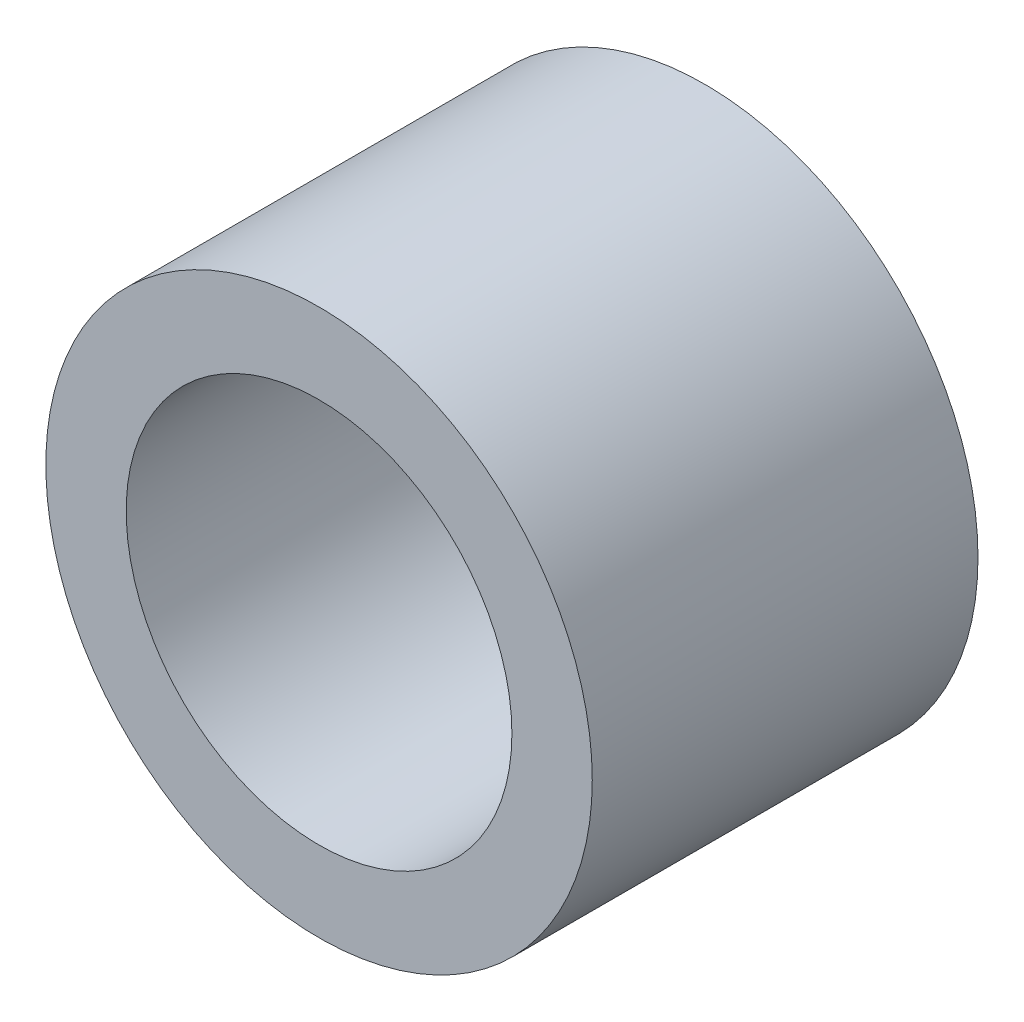
ISO-10303-21;
HEADER;
FILE_DESCRIPTION(('STEP AP214'),'2;1');
FILE_NAME('part.step','',(''),(''),'','','');
FILE_SCHEMA(('AUTOMOTIVE_DESIGN { 1 0 10303 214 1 1 1 1 }'));
ENDSEC;
DATA;
#1=APPLICATION_CONTEXT('core data for automotive mechanical design processes');
#2=APPLICATION_PROTOCOL_DEFINITION('international standard','automotive_design',2000,#1);
#3=PRODUCT_CONTEXT('',#1,'mechanical');
#4=PRODUCT('Part','Part','',(#3));
#5=PRODUCT_RELATED_PRODUCT_CATEGORY('part','',(#4));
#6=PRODUCT_DEFINITION_FORMATION('','',#4);
#7=PRODUCT_DEFINITION_CONTEXT('part definition',#1,'design');
#8=PRODUCT_DEFINITION('design','',#6,#7);
#9=PRODUCT_DEFINITION_SHAPE('','',#8);
#10=(LENGTH_UNIT() NAMED_UNIT(*) SI_UNIT(.MILLI.,.METRE.));
#11=(NAMED_UNIT(*) PLANE_ANGLE_UNIT() SI_UNIT($,.RADIAN.));
#12=(NAMED_UNIT(*) SI_UNIT($,.STERADIAN.) SOLID_ANGLE_UNIT());
#13=UNCERTAINTY_MEASURE_WITH_UNIT(LENGTH_MEASURE(1.E-05),#10,'distance_accuracy_value','');
#14=(GEOMETRIC_REPRESENTATION_CONTEXT(3) GLOBAL_UNCERTAINTY_ASSIGNED_CONTEXT((#13)) GLOBAL_UNIT_ASSIGNED_CONTEXT((#10,
#11,#12)) REPRESENTATION_CONTEXT('',''));
#15=CARTESIAN_POINT('',(0.,0.,0.));
#16=DIRECTION('',(0.,0.,1.));
#17=DIRECTION('',(1.,0.,0.));
#18=AXIS2_PLACEMENT_3D('',#15,#16,#17);
#19=CARTESIAN_POINT('',(0.,0.,0.8));
#20=DIRECTION('',(0.,0.,-1.));
#21=DIRECTION('',(-1.,0.,0.));
#22=AXIS2_PLACEMENT_3D('',#19,#20,#21);
#23=CYLINDRICAL_SURFACE('',#22,3.4);
#24=CARTESIAN_POINT('',(0.,0.,0.));
#25=DIRECTION('',(0.,0.,1.));
#26=DIRECTION('',(1.,0.,0.));
#27=AXIS2_PLACEMENT_3D('',#24,#25,#26);
#28=CIRCLE('',#27,3.4);
#29=CARTESIAN_POINT('',(3.4,0.,0.));
#30=VERTEX_POINT('',#29);
#31=EDGE_CURVE('E38',#30,#30,#28,.T.);
#32=ORIENTED_EDGE('',*,*,#31,.T.);
#33=EDGE_LOOP('',(#32));
#34=FACE_BOUND('',#33,.T.);
#35=CARTESIAN_POINT('',(0.,0.,4.8));
#36=DIRECTION('',(0.,0.,1.));
#37=DIRECTION('',(1.,0.,0.));
#38=AXIS2_PLACEMENT_3D('',#35,#36,#37);
#39=CIRCLE('',#38,3.4);
#40=CARTESIAN_POINT('',(3.4,0.,4.8));
#41=VERTEX_POINT('',#40);
#42=EDGE_CURVE('E42',#41,#41,#39,.T.);
#43=ORIENTED_EDGE('',*,*,#42,.F.);
#44=EDGE_LOOP('',(#43));
#45=FACE_BOUND('',#44,.T.);
#46=ADVANCED_FACE('F32',(#34,#45),#23,.T.);
#47=CARTESIAN_POINT('',(0.,0.,0.));
#48=DIRECTION('',(0.,0.,1.));
#49=DIRECTION('',(1.,0.,0.));
#50=AXIS2_PLACEMENT_3D('',#47,#48,#49);
#51=PLANE('',#50);
#52=ORIENTED_EDGE('',*,*,#31,.F.);
#53=EDGE_LOOP('',(#52));
#54=FACE_BOUND('',#53,.T.);
#55=ADVANCED_FACE('F56',(#54),#51,.F.);
#56=CARTESIAN_POINT('',(0.,0.,4.8));
#57=DIRECTION('',(0.,0.,1.));
#58=DIRECTION('',(1.,0.,0.));
#59=AXIS2_PLACEMENT_3D('',#56,#57,#58);
#60=PLANE('',#59);
#61=ORIENTED_EDGE('',*,*,#42,.T.);
#62=EDGE_LOOP('',(#61));
#63=FACE_BOUND('',#62,.T.);
#64=CARTESIAN_POINT('',(0.,0.,4.8));
#65=DIRECTION('',(0.,0.,1.));
#66=DIRECTION('',(1.,0.,0.));
#67=AXIS2_PLACEMENT_3D('',#64,#65,#66);
#68=CIRCLE('',#67,2.4);
#69=CARTESIAN_POINT('',(2.4,0.,4.8));
#70=VERTEX_POINT('',#69);
#71=EDGE_CURVE('E46',#70,#70,#68,.T.);
#72=ORIENTED_EDGE('',*,*,#71,.F.);
#73=EDGE_LOOP('',(#72));
#74=FACE_BOUND('',#73,.T.);
#75=ADVANCED_FACE('F54',(#63,#74),#60,.T.);
#76=CARTESIAN_POINT('',(0.,0.,4.8));
#77=DIRECTION('',(0.,0.,-1.));
#78=DIRECTION('',(-1.,0.,0.));
#79=AXIS2_PLACEMENT_3D('',#76,#77,#78);
#80=CYLINDRICAL_SURFACE('',#79,2.4);
#81=ORIENTED_EDGE('',*,*,#71,.T.);
#82=EDGE_LOOP('',(#81));
#83=FACE_BOUND('',#82,.T.);
#84=CARTESIAN_POINT('',(0.,0.,0.8));
#85=DIRECTION('',(0.,0.,1.));
#86=DIRECTION('',(1.,0.,0.));
#87=AXIS2_PLACEMENT_3D('',#84,#85,#86);
#88=CIRCLE('',#87,2.4);
#89=CARTESIAN_POINT('',(2.4,0.,0.8));
#90=VERTEX_POINT('',#89);
#91=EDGE_CURVE('E10',#90,#90,#88,.F.);
#92=ORIENTED_EDGE('',*,*,#91,.T.);
#93=EDGE_LOOP('',(#92));
#94=FACE_BOUND('',#93,.T.);
#95=ADVANCED_FACE('F52',(#83,#94),#80,.F.);
#96=CARTESIAN_POINT('',(0.,0.,0.8));
#97=DIRECTION('',(0.,0.,1.));
#98=DIRECTION('',(1.,0.,0.));
#99=AXIS2_PLACEMENT_3D('',#96,#97,#98);
#100=PLANE('',#99);
#101=ORIENTED_EDGE('',*,*,#91,.F.);
#102=EDGE_LOOP('',(#101));
#103=FACE_BOUND('',#102,.T.);
#104=ADVANCED_FACE('F63',(#103),#100,.T.);
#105=CLOSED_SHELL('',(#46,#55,#75,#95,#104));
#106=MANIFOLD_SOLID_BREP('B2',#105);
#107=ADVANCED_BREP_SHAPE_REPRESENTATION('',(#18,#106),#14);
#108=SHAPE_DEFINITION_REPRESENTATION(#9,#107);
ENDSEC;
END-ISO-10303-21;
